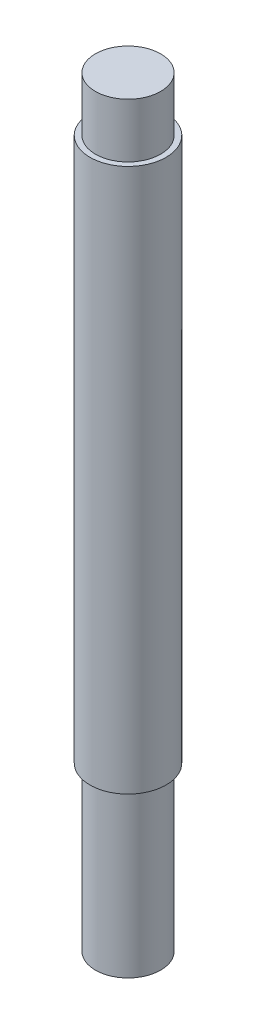
ISO-10303-21;
HEADER;
FILE_DESCRIPTION(('STEP AP214'),'2;1');
FILE_NAME('part.step','',(''),(''),'','','');
FILE_SCHEMA(('AUTOMOTIVE_DESIGN { 1 0 10303 214 1 1 1 1 }'));
ENDSEC;
DATA;
#1=APPLICATION_CONTEXT('core data for automotive mechanical design processes');
#2=APPLICATION_PROTOCOL_DEFINITION('international standard','automotive_design',2000,#1);
#3=PRODUCT_CONTEXT('',#1,'mechanical');
#4=PRODUCT('Part','Part','',(#3));
#5=PRODUCT_RELATED_PRODUCT_CATEGORY('part','',(#4));
#6=PRODUCT_DEFINITION_FORMATION('','',#4);
#7=PRODUCT_DEFINITION_CONTEXT('part definition',#1,'design');
#8=PRODUCT_DEFINITION('design','',#6,#7);
#9=PRODUCT_DEFINITION_SHAPE('','',#8);
#10=(LENGTH_UNIT() NAMED_UNIT(*) SI_UNIT(.MILLI.,.METRE.));
#11=(NAMED_UNIT(*) PLANE_ANGLE_UNIT() SI_UNIT($,.RADIAN.));
#12=(NAMED_UNIT(*) SI_UNIT($,.STERADIAN.) SOLID_ANGLE_UNIT());
#13=UNCERTAINTY_MEASURE_WITH_UNIT(LENGTH_MEASURE(1.E-05),#10,'distance_accuracy_value','');
#14=(GEOMETRIC_REPRESENTATION_CONTEXT(3) GLOBAL_UNCERTAINTY_ASSIGNED_CONTEXT((#13)) GLOBAL_UNIT_ASSIGNED_CONTEXT((#10,
#11,#12)) REPRESENTATION_CONTEXT('',''));
#15=CARTESIAN_POINT('',(0.,0.,0.));
#16=DIRECTION('',(0.,0.,1.));
#17=DIRECTION('',(1.,0.,0.));
#18=AXIS2_PLACEMENT_3D('',#15,#16,#17);
#19=CARTESIAN_POINT('',(0.,30.,0.));
#20=DIRECTION('',(0.,1.,0.));
#21=DIRECTION('',(0.,0.,1.));
#22=AXIS2_PLACEMENT_3D('',#19,#20,#21);
#23=PLANE('',#22);
#24=CARTESIAN_POINT('',(0.,30.,0.));
#25=DIRECTION('',(0.,-1.,0.));
#26=DIRECTION('',(0.,0.,-1.));
#27=AXIS2_PLACEMENT_3D('',#24,#25,#26);
#28=CIRCLE('',#27,3.);
#29=CARTESIAN_POINT('',(0.,30.,-3.));
#30=VERTEX_POINT('',#29);
#31=EDGE_CURVE('E10',#30,#30,#28,.T.);
#32=ORIENTED_EDGE('',*,*,#31,.F.);
#33=EDGE_LOOP('',(#32));
#34=FACE_BOUND('',#33,.T.);
#35=ADVANCED_FACE('F30',(#34),#23,.T.);
#36=CARTESIAN_POINT('',(0.,0.,0.));
#37=DIRECTION('',(0.,-1.,0.));
#38=DIRECTION('',(0.,0.,-1.));
#39=AXIS2_PLACEMENT_3D('',#36,#37,#38);
#40=CYLINDRICAL_SURFACE('',#39,3.);
#41=ORIENTED_EDGE('',*,*,#31,.T.);
#42=EDGE_LOOP('',(#41));
#43=FACE_BOUND('',#42,.T.);
#44=CARTESIAN_POINT('',(0.,25.,0.));
#45=DIRECTION('',(0.,-1.,0.));
#46=DIRECTION('',(0.,0.,-1.));
#47=AXIS2_PLACEMENT_3D('',#44,#45,#46);
#48=CIRCLE('',#47,3.);
#49=CARTESIAN_POINT('',(0.,25.,-3.));
#50=VERTEX_POINT('',#49);
#51=EDGE_CURVE('E36',#50,#50,#48,.T.);
#52=ORIENTED_EDGE('',*,*,#51,.F.);
#53=EDGE_LOOP('',(#52));
#54=FACE_BOUND('',#53,.T.);
#55=ADVANCED_FACE('F72',(#43,#54),#40,.T.);
#56=CARTESIAN_POINT('',(3.,25.,0.));
#57=DIRECTION('',(0.,1.,0.));
#58=DIRECTION('',(0.,0.,1.));
#59=AXIS2_PLACEMENT_3D('',#56,#57,#58);
#60=PLANE('',#59);
#61=ORIENTED_EDGE('',*,*,#51,.T.);
#62=EDGE_LOOP('',(#61));
#63=FACE_BOUND('',#62,.T.);
#64=CARTESIAN_POINT('',(0.,25.,0.));
#65=DIRECTION('',(0.,-1.,0.));
#66=DIRECTION('',(0.,0.,-1.));
#67=AXIS2_PLACEMENT_3D('',#64,#65,#66);
#68=CIRCLE('',#67,3.5);
#69=CARTESIAN_POINT('',(0.,25.,-3.5));
#70=VERTEX_POINT('',#69);
#71=EDGE_CURVE('E40',#70,#70,#68,.T.);
#72=ORIENTED_EDGE('',*,*,#71,.F.);
#73=EDGE_LOOP('',(#72));
#74=FACE_BOUND('',#73,.T.);
#75=ADVANCED_FACE('F77',(#63,#74),#60,.T.);
#76=CARTESIAN_POINT('',(0.,0.,0.));
#77=DIRECTION('',(0.,-1.,0.));
#78=DIRECTION('',(0.,0.,-1.));
#79=AXIS2_PLACEMENT_3D('',#76,#77,#78);
#80=CYLINDRICAL_SURFACE('',#79,3.5);
#81=ORIENTED_EDGE('',*,*,#71,.T.);
#82=EDGE_LOOP('',(#81));
#83=FACE_BOUND('',#82,.T.);
#84=CARTESIAN_POINT('',(0.,-25.,0.));
#85=DIRECTION('',(0.,-1.,0.));
#86=DIRECTION('',(0.,0.,-1.));
#87=AXIS2_PLACEMENT_3D('',#84,#85,#86);
#88=CIRCLE('',#87,3.50000000000001);
#89=CARTESIAN_POINT('',(0.,-25.,-3.50000000000001));
#90=VERTEX_POINT('',#89);
#91=EDGE_CURVE('E44',#90,#90,#88,.T.);
#92=ORIENTED_EDGE('',*,*,#91,.F.);
#93=EDGE_LOOP('',(#92));
#94=FACE_BOUND('',#93,.T.);
#95=ADVANCED_FACE('F68',(#83,#94),#80,.T.);
#96=CARTESIAN_POINT('',(3.50000000000001,-25.,0.));
#97=DIRECTION('',(0.,-1.,0.));
#98=DIRECTION('',(0.,0.,-1.));
#99=AXIS2_PLACEMENT_3D('',#96,#97,#98);
#100=PLANE('',#99);
#101=ORIENTED_EDGE('',*,*,#91,.T.);
#102=EDGE_LOOP('',(#101));
#103=FACE_BOUND('',#102,.T.);
#104=CARTESIAN_POINT('',(0.,-25.,0.));
#105=DIRECTION('',(0.,-1.,0.));
#106=DIRECTION('',(0.,0.,-1.));
#107=AXIS2_PLACEMENT_3D('',#104,#105,#106);
#108=CIRCLE('',#107,3.00000000000001);
#109=CARTESIAN_POINT('',(0.,-25.,-3.00000000000001));
#110=VERTEX_POINT('',#109);
#111=EDGE_CURVE('E49',#110,#110,#108,.T.);
#112=ORIENTED_EDGE('',*,*,#111,.F.);
#113=EDGE_LOOP('',(#112));
#114=FACE_BOUND('',#113,.T.);
#115=ADVANCED_FACE('F60',(#103,#114),#100,.T.);
#116=CARTESIAN_POINT('',(0.,0.,0.));
#117=DIRECTION('',(0.,-1.,0.));
#118=DIRECTION('',(0.,0.,-1.));
#119=AXIS2_PLACEMENT_3D('',#116,#117,#118);
#120=CYLINDRICAL_SURFACE('',#119,3.00000000000001);
#121=ORIENTED_EDGE('',*,*,#111,.T.);
#122=EDGE_LOOP('',(#121));
#123=FACE_BOUND('',#122,.T.);
#124=CARTESIAN_POINT('',(0.,-40.,0.));
#125=DIRECTION('',(0.,-1.,0.));
#126=DIRECTION('',(0.,0.,-1.));
#127=AXIS2_PLACEMENT_3D('',#124,#125,#126);
#128=CIRCLE('',#127,3.00000000000001);
#129=CARTESIAN_POINT('',(0.,-40.,-3.00000000000001));
#130=VERTEX_POINT('',#129);
#131=EDGE_CURVE('E52',#130,#130,#128,.T.);
#132=ORIENTED_EDGE('',*,*,#131,.F.);
#133=EDGE_LOOP('',(#132));
#134=FACE_BOUND('',#133,.T.);
#135=ADVANCED_FACE('F58',(#123,#134),#120,.T.);
#136=CARTESIAN_POINT('',(3.00000000000001,-40.,0.));
#137=DIRECTION('',(0.,-1.,0.));
#138=DIRECTION('',(0.,0.,-1.));
#139=AXIS2_PLACEMENT_3D('',#136,#137,#138);
#140=PLANE('',#139);
#141=ORIENTED_EDGE('',*,*,#131,.T.);
#142=EDGE_LOOP('',(#141));
#143=FACE_BOUND('',#142,.T.);
#144=ADVANCED_FACE('F56',(#143),#140,.T.);
#145=CLOSED_SHELL('',(#35,#55,#75,#95,#115,#135,#144));
#146=MANIFOLD_SOLID_BREP('B2',#145);
#147=ADVANCED_BREP_SHAPE_REPRESENTATION('',(#18,#146),#14);
#148=SHAPE_DEFINITION_REPRESENTATION(#9,#147);
ENDSEC;
END-ISO-10303-21;
